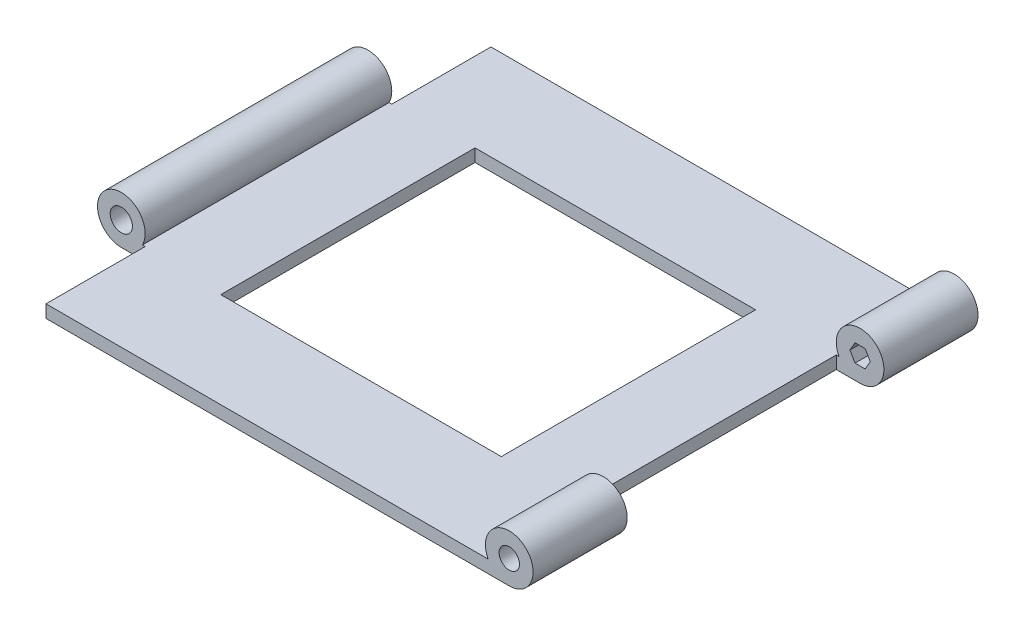
ISO-10303-21;
HEADER;
FILE_DESCRIPTION(('STEP AP214'),'2;1');
FILE_NAME('part.step','',(''),(''),'','','');
FILE_SCHEMA(('AUTOMOTIVE_DESIGN { 1 0 10303 214 1 1 1 1 }'));
ENDSEC;
DATA;
#1=APPLICATION_CONTEXT('core data for automotive mechanical design processes');
#2=APPLICATION_PROTOCOL_DEFINITION('international standard','automotive_design',2000,#1);
#3=PRODUCT_CONTEXT('',#1,'mechanical');
#4=PRODUCT('Part','Part','',(#3));
#5=PRODUCT_RELATED_PRODUCT_CATEGORY('part','',(#4));
#6=PRODUCT_DEFINITION_FORMATION('','',#4);
#7=PRODUCT_DEFINITION_CONTEXT('part definition',#1,'design');
#8=PRODUCT_DEFINITION('design','',#6,#7);
#9=PRODUCT_DEFINITION_SHAPE('','',#8);
#10=(LENGTH_UNIT() NAMED_UNIT(*) SI_UNIT(.MILLI.,.METRE.));
#11=(NAMED_UNIT(*) PLANE_ANGLE_UNIT() SI_UNIT($,.RADIAN.));
#12=(NAMED_UNIT(*) SI_UNIT($,.STERADIAN.) SOLID_ANGLE_UNIT());
#13=UNCERTAINTY_MEASURE_WITH_UNIT(LENGTH_MEASURE(1.E-05),#10,'distance_accuracy_value','');
#14=(GEOMETRIC_REPRESENTATION_CONTEXT(3) GLOBAL_UNCERTAINTY_ASSIGNED_CONTEXT((#13)) GLOBAL_UNIT_ASSIGNED_CONTEXT((#10,
#11,#12)) REPRESENTATION_CONTEXT('',''));
#15=CARTESIAN_POINT('',(0.,0.,0.));
#16=DIRECTION('',(0.,0.,1.));
#17=DIRECTION('',(1.,0.,0.));
#18=AXIS2_PLACEMENT_3D('',#15,#16,#17);
#19=CARTESIAN_POINT('',(75.786771652315,2.11250507632989,-140.));
#20=DIRECTION('',(0.,0.,1.));
#21=DIRECTION('',(1.,0.,0.));
#22=AXIS2_PLACEMENT_3D('',#19,#20,#21);
#23=CYLINDRICAL_SURFACE('',#22,7.5);
#24=CARTESIAN_POINT('',(75.786771652315,2.11250507632989,-29.6));
#25=DIRECTION('',(0.,0.,1.));
#26=DIRECTION('',(0.,-1.,0.));
#27=AXIS2_PLACEMENT_3D('',#24,#25,#26);
#28=CIRCLE('',#27,7.5);
#29=CARTESIAN_POINT('',(69.1535220716042,-1.38749492367011,-29.6));
#30=VERTEX_POINT('',#29);
#31=CARTESIAN_POINT('',(75.786771652315,-5.38749492367011,-29.6));
#32=VERTEX_POINT('',#31);
#33=EDGE_CURVE('E223',#30,#32,#28,.F.);
#34=ORIENTED_EDGE('',*,*,#33,.F.);
#35=DIRECTION('',(0.,0.,1.));
#36=VECTOR('',#35,1.);
#37=CARTESIAN_POINT('',(69.1535220716042,-1.38749492367011,-140.));
#38=LINE('',#37,#36);
#39=CARTESIAN_POINT('',(69.1535220716042,-1.38749492367011,0.));
#40=VERTEX_POINT('',#39);
#41=EDGE_CURVE('E334',#30,#40,#38,.T.);
#42=ORIENTED_EDGE('',*,*,#41,.T.);
#43=CARTESIAN_POINT('',(75.786771652315,2.11250507632989,0.));
#44=DIRECTION('',(0.,0.,1.));
#45=DIRECTION('',(1.,0.,0.));
#46=AXIS2_PLACEMENT_3D('',#43,#44,#45);
#47=CIRCLE('',#46,7.5);
#48=CARTESIAN_POINT('',(75.786771652315,-5.38749492367011,0.));
#49=VERTEX_POINT('',#48);
#50=EDGE_CURVE('E310',#49,#40,#47,.T.);
#51=ORIENTED_EDGE('',*,*,#50,.F.);
#52=DIRECTION('',(0.,0.,1.));
#53=VECTOR('',#52,1.);
#54=CARTESIAN_POINT('',(75.786771652315,-5.38749492367011,-140.));
#55=LINE('',#54,#53);
#56=EDGE_CURVE('E346',#32,#49,#55,.T.);
#57=ORIENTED_EDGE('',*,*,#56,.F.);
#58=EDGE_LOOP('',(#34,#42,#51,#57));
#59=FACE_BOUND('',#58,.T.);
#60=ADVANCED_FACE('F35',(#59),#23,.T.);
#61=CARTESIAN_POINT('',(78.986771652315,2.11250507632989,-140.));
#62=DIRECTION('',(0.866025403784437,0.500000000000002,0.));
#63=DIRECTION('',(-0.500000000000002,0.866025403784437,0.));
#64=AXIS2_PLACEMENT_3D('',#61,#62,#63);
#65=PLANE('',#64);
#66=DIRECTION('',(0.,0.,1.));
#67=VECTOR('',#66,1.);
#68=CARTESIAN_POINT('',(78.986771652315,2.11250507632989,-140.));
#69=LINE('',#68,#67);
#70=CARTESIAN_POINT('',(78.986771652315,2.11250507632989,-140.));
#71=VERTEX_POINT('',#70);
#72=CARTESIAN_POINT('',(78.986771652315,2.11250507632989,-110.4));
#73=VERTEX_POINT('',#72);
#74=EDGE_CURVE('E307',#71,#73,#69,.T.);
#75=ORIENTED_EDGE('',*,*,#74,.T.);
#76=DIRECTION('',(-0.500000000000002,0.866025403784437,0.));
#77=VECTOR('',#76,1.);
#78=CARTESIAN_POINT('',(78.986771652315,2.11250507632989,-110.4));
#79=LINE('',#78,#77);
#80=CARTESIAN_POINT('',(77.386771652315,4.88378636844011,-110.4));
#81=VERTEX_POINT('',#80);
#82=EDGE_CURVE('E239',#73,#81,#79,.T.);
#83=ORIENTED_EDGE('',*,*,#82,.T.);
#84=DIRECTION('',(0.,0.,1.));
#85=VECTOR('',#84,1.);
#86=CARTESIAN_POINT('',(77.386771652315,4.88378636844011,-140.));
#87=LINE('',#86,#85);
#88=CARTESIAN_POINT('',(77.386771652315,4.88378636844011,-140.));
#89=VERTEX_POINT('',#88);
#90=EDGE_CURVE('E306',#89,#81,#87,.T.);
#91=ORIENTED_EDGE('',*,*,#90,.F.);
#92=DIRECTION('',(-0.500000000000002,0.866025403784437,0.));
#93=VECTOR('',#92,1.);
#94=CARTESIAN_POINT('',(78.986771652315,2.11250507632989,-140.));
#95=LINE('',#94,#93);
#96=EDGE_CURVE('E288',#71,#89,#95,.T.);
#97=ORIENTED_EDGE('',*,*,#96,.F.);
#98=EDGE_LOOP('',(#75,#83,#91,#97));
#99=FACE_BOUND('',#98,.T.);
#100=ADVANCED_FACE('F391',(#99),#65,.F.);
#101=CARTESIAN_POINT('',(77.386771652315,-0.658776215780301,-140.));
#102=DIRECTION('',(0.866025403784439,-0.5,0.));
#103=DIRECTION('',(0.5,0.866025403784439,0.));
#104=AXIS2_PLACEMENT_3D('',#101,#102,#103);
#105=PLANE('',#104);
#106=DIRECTION('',(0.,0.,1.));
#107=VECTOR('',#106,1.);
#108=CARTESIAN_POINT('',(77.386771652315,-0.658776215780301,-140.));
#109=LINE('',#108,#107);
#110=CARTESIAN_POINT('',(77.386771652315,-0.658776215780301,-140.));
#111=VERTEX_POINT('',#110);
#112=CARTESIAN_POINT('',(77.386771652315,-0.658776215780301,-110.4));
#113=VERTEX_POINT('',#112);
#114=EDGE_CURVE('E311',#111,#113,#109,.T.);
#115=ORIENTED_EDGE('',*,*,#114,.T.);
#116=DIRECTION('',(0.5,0.866025403784439,0.));
#117=VECTOR('',#116,1.);
#118=CARTESIAN_POINT('',(77.386771652315,-0.658776215780301,-110.4));
#119=LINE('',#118,#117);
#120=EDGE_CURVE('E236',#113,#73,#119,.T.);
#121=ORIENTED_EDGE('',*,*,#120,.T.);
#122=ORIENTED_EDGE('',*,*,#74,.F.);
#123=DIRECTION('',(0.5,0.866025403784439,0.));
#124=VECTOR('',#123,1.);
#125=CARTESIAN_POINT('',(77.386771652315,-0.658776215780301,-140.));
#126=LINE('',#125,#124);
#127=EDGE_CURVE('E303',#111,#71,#126,.T.);
#128=ORIENTED_EDGE('',*,*,#127,.F.);
#129=EDGE_LOOP('',(#115,#121,#122,#128));
#130=FACE_BOUND('',#129,.T.);
#131=ADVANCED_FACE('F396',(#130),#105,.F.);
#132=CARTESIAN_POINT('',(74.186771652315,-0.658776215780301,-140.));
#133=DIRECTION('',(0.,-1.,0.));
#134=DIRECTION('',(0.,0.,-1.));
#135=AXIS2_PLACEMENT_3D('',#132,#133,#134);
#136=PLANE('',#135);
#137=DIRECTION('',(0.,0.,1.));
#138=VECTOR('',#137,1.);
#139=CARTESIAN_POINT('',(74.186771652315,-0.658776215780301,-140.));
#140=LINE('',#139,#138);
#141=CARTESIAN_POINT('',(74.186771652315,-0.658776215780301,-140.));
#142=VERTEX_POINT('',#141);
#143=CARTESIAN_POINT('',(74.186771652315,-0.658776215780301,-110.4));
#144=VERTEX_POINT('',#143);
#145=EDGE_CURVE('E314',#142,#144,#140,.T.);
#146=ORIENTED_EDGE('',*,*,#145,.T.);
#147=DIRECTION('',(1.,0.,0.));
#148=VECTOR('',#147,1.);
#149=CARTESIAN_POINT('',(74.186771652315,-0.658776215780301,-110.4));
#150=LINE('',#149,#148);
#151=EDGE_CURVE('E233',#144,#113,#150,.T.);
#152=ORIENTED_EDGE('',*,*,#151,.T.);
#153=ORIENTED_EDGE('',*,*,#114,.F.);
#154=DIRECTION('',(1.,0.,0.));
#155=VECTOR('',#154,1.);
#156=CARTESIAN_POINT('',(74.186771652315,-0.658776215780301,-140.));
#157=LINE('',#156,#155);
#158=EDGE_CURVE('E300',#142,#111,#157,.T.);
#159=ORIENTED_EDGE('',*,*,#158,.F.);
#160=EDGE_LOOP('',(#146,#152,#153,#159));
#161=FACE_BOUND('',#160,.T.);
#162=ADVANCED_FACE('F465',(#161),#136,.F.);
#163=CARTESIAN_POINT('',(72.586771652315,2.11250507632989,-140.));
#164=DIRECTION('',(-0.866025403784439,-0.5,0.));
#165=DIRECTION('',(0.5,-0.866025403784439,0.));
#166=AXIS2_PLACEMENT_3D('',#163,#164,#165);
#167=PLANE('',#166);
#168=DIRECTION('',(0.,0.,1.));
#169=VECTOR('',#168,1.);
#170=CARTESIAN_POINT('',(72.586771652315,2.11250507632989,-140.));
#171=LINE('',#170,#169);
#172=CARTESIAN_POINT('',(72.586771652315,2.11250507632989,-140.));
#173=VERTEX_POINT('',#172);
#174=CARTESIAN_POINT('',(72.586771652315,2.11250507632989,-110.4));
#175=VERTEX_POINT('',#174);
#176=EDGE_CURVE('E317',#173,#175,#171,.T.);
#177=ORIENTED_EDGE('',*,*,#176,.T.);
#178=DIRECTION('',(0.5,-0.866025403784439,0.));
#179=VECTOR('',#178,1.);
#180=CARTESIAN_POINT('',(72.586771652315,2.11250507632989,-110.4));
#181=LINE('',#180,#179);
#182=EDGE_CURVE('E230',#175,#144,#181,.T.);
#183=ORIENTED_EDGE('',*,*,#182,.T.);
#184=ORIENTED_EDGE('',*,*,#145,.F.);
#185=DIRECTION('',(0.5,-0.866025403784439,0.));
#186=VECTOR('',#185,1.);
#187=CARTESIAN_POINT('',(72.586771652315,2.11250507632989,-140.));
#188=LINE('',#187,#186);
#189=EDGE_CURVE('E297',#173,#142,#188,.T.);
#190=ORIENTED_EDGE('',*,*,#189,.F.);
#191=EDGE_LOOP('',(#177,#183,#184,#190));
#192=FACE_BOUND('',#191,.T.);
#193=ADVANCED_FACE('F472',(#192),#167,.F.);
#194=CARTESIAN_POINT('',(74.186771652315,4.88378636844011,-140.));
#195=DIRECTION('',(-0.866025403784439,0.499999999999999,0.));
#196=DIRECTION('',(-0.499999999999999,-0.866025403784439,0.));
#197=AXIS2_PLACEMENT_3D('',#194,#195,#196);
#198=PLANE('',#197);
#199=DIRECTION('',(0.,0.,1.));
#200=VECTOR('',#199,1.);
#201=CARTESIAN_POINT('',(74.186771652315,4.88378636844011,-140.));
#202=LINE('',#201,#200);
#203=CARTESIAN_POINT('',(74.186771652315,4.88378636844011,-140.));
#204=VERTEX_POINT('',#203);
#205=CARTESIAN_POINT('',(74.186771652315,4.88378636844011,-110.4));
#206=VERTEX_POINT('',#205);
#207=EDGE_CURVE('E320',#204,#206,#202,.T.);
#208=ORIENTED_EDGE('',*,*,#207,.T.);
#209=DIRECTION('',(-0.499999999999999,-0.866025403784439,0.));
#210=VECTOR('',#209,1.);
#211=CARTESIAN_POINT('',(74.186771652315,4.88378636844011,-110.4));
#212=LINE('',#211,#210);
#213=EDGE_CURVE('E227',#206,#175,#212,.T.);
#214=ORIENTED_EDGE('',*,*,#213,.T.);
#215=ORIENTED_EDGE('',*,*,#176,.F.);
#216=DIRECTION('',(-0.499999999999999,-0.866025403784439,0.));
#217=VECTOR('',#216,1.);
#218=CARTESIAN_POINT('',(74.186771652315,4.88378636844011,-140.));
#219=LINE('',#218,#217);
#220=EDGE_CURVE('E294',#204,#173,#219,.T.);
#221=ORIENTED_EDGE('',*,*,#220,.F.);
#222=EDGE_LOOP('',(#208,#214,#215,#221));
#223=FACE_BOUND('',#222,.T.);
#224=ADVANCED_FACE('F474',(#223),#198,.F.);
#225=CARTESIAN_POINT('',(77.386771652315,4.88378636844011,-140.));
#226=DIRECTION('',(0.,1.,0.));
#227=DIRECTION('',(0.,0.,1.));
#228=AXIS2_PLACEMENT_3D('',#225,#226,#227);
#229=PLANE('',#228);
#230=ORIENTED_EDGE('',*,*,#90,.T.);
#231=DIRECTION('',(-1.,0.,0.));
#232=VECTOR('',#231,1.);
#233=CARTESIAN_POINT('',(77.386771652315,4.88378636844011,-110.4));
#234=LINE('',#233,#232);
#235=EDGE_CURVE('E345',#81,#206,#234,.T.);
#236=ORIENTED_EDGE('',*,*,#235,.T.);
#237=ORIENTED_EDGE('',*,*,#207,.F.);
#238=DIRECTION('',(-1.,0.,0.));
#239=VECTOR('',#238,1.);
#240=CARTESIAN_POINT('',(77.386771652315,4.88378636844011,-140.));
#241=LINE('',#240,#239);
#242=EDGE_CURVE('E291',#89,#204,#241,.T.);
#243=ORIENTED_EDGE('',*,*,#242,.F.);
#244=EDGE_LOOP('',(#230,#236,#237,#243));
#245=FACE_BOUND('',#244,.T.);
#246=ADVANCED_FACE('F408',(#245),#229,.F.);
#247=CARTESIAN_POINT('',(75.786771652315,2.11250507632989,0.));
#248=DIRECTION('',(0.,0.,1.));
#249=DIRECTION('',(1.,0.,0.));
#250=AXIS2_PLACEMENT_3D('',#247,#248,#249);
#251=PLANE('',#250);
#252=CARTESIAN_POINT('',(75.786771652315,2.11250507632989,0.));
#253=DIRECTION('',(0.,0.,-1.));
#254=DIRECTION('',(-1.,0.,0.));
#255=AXIS2_PLACEMENT_3D('',#252,#253,#254);
#256=CIRCLE('',#255,3.20000000000002);
#257=CARTESIAN_POINT('',(72.586771652315,2.11250507632989,0.));
#258=VERTEX_POINT('',#257);
#259=EDGE_CURVE('E209',#258,#258,#256,.T.);
#260=ORIENTED_EDGE('',*,*,#259,.T.);
#261=EDGE_LOOP('',(#260));
#262=FACE_BOUND('',#261,.T.);
#263=DIRECTION('',(-1.,0.,0.));
#264=VECTOR('',#263,1.);
#265=CARTESIAN_POINT('',(69.1535220716042,-1.38749492367011,0.));
#266=LINE('',#265,#264);
#267=CARTESIAN_POINT('',(-69.9797275091066,-1.38749492367012,0.));
#268=VERTEX_POINT('',#267);
#269=EDGE_CURVE('E337',#40,#268,#266,.T.);
#270=ORIENTED_EDGE('',*,*,#269,.T.);
#271=DIRECTION('',(0.,-1.,0.));
#272=VECTOR('',#271,1.);
#273=CARTESIAN_POINT('',(-69.9797275091066,-7.86745165641634,0.));
#274=LINE('',#273,#272);
#275=CARTESIAN_POINT('',(-69.9797275091066,-5.38749492367015,0.));
#276=VERTEX_POINT('',#275);
#277=EDGE_CURVE('E252',#268,#276,#274,.T.);
#278=ORIENTED_EDGE('',*,*,#277,.T.);
#279=DIRECTION('',(1.,0.,0.));
#280=VECTOR('',#279,1.);
#281=CARTESIAN_POINT('',(-77.4797275091066,-5.38749492367015,0.));
#282=LINE('',#281,#280);
#283=EDGE_CURVE('E329',#276,#49,#282,.T.);
#284=ORIENTED_EDGE('',*,*,#283,.T.);
#285=ORIENTED_EDGE('',*,*,#50,.T.);
#286=EDGE_LOOP('',(#270,#278,#284,#285));
#287=FACE_BOUND('',#286,.T.);
#288=ADVANCED_FACE('F400',(#262,#287),#251,.T.);
#289=CARTESIAN_POINT('',(69.1535220716042,-1.38749492367011,-140.));
#290=VERTEX_POINT('',#289);
#291=CARTESIAN_POINT('',(69.1535220716042,-1.38749492367011,-110.4));
#292=VERTEX_POINT('',#291);
#293=EDGE_CURVE('E353',#290,#292,#38,.T.);
#294=ORIENTED_EDGE('',*,*,#293,.T.);
#295=CARTESIAN_POINT('',(75.786771652315,2.11250507632989,-110.4));
#296=DIRECTION('',(0.,0.,-1.));
#297=DIRECTION('',(-1.,0.,0.));
#298=AXIS2_PLACEMENT_3D('',#295,#296,#297);
#299=CIRCLE('',#298,7.5);
#300=CARTESIAN_POINT('',(75.786771652315,-5.38749492367011,-110.4));
#301=VERTEX_POINT('',#300);
#302=EDGE_CURVE('E245',#301,#292,#299,.F.);
#303=ORIENTED_EDGE('',*,*,#302,.F.);
#304=CARTESIAN_POINT('',(75.786771652315,-5.38749492367011,-140.));
#305=VERTEX_POINT('',#304);
#306=EDGE_CURVE('E342',#305,#301,#55,.T.);
#307=ORIENTED_EDGE('',*,*,#306,.F.);
#308=CARTESIAN_POINT('',(75.786771652315,2.11250507632989,-140.));
#309=DIRECTION('',(0.,0.,1.));
#310=DIRECTION('',(1.,0.,0.));
#311=AXIS2_PLACEMENT_3D('',#308,#309,#310);
#312=CIRCLE('',#311,7.5);
#313=EDGE_CURVE('E325',#305,#290,#312,.T.);
#314=ORIENTED_EDGE('',*,*,#313,.T.);
#315=EDGE_LOOP('',(#294,#303,#307,#314));
#316=FACE_BOUND('',#315,.T.);
#317=ADVANCED_FACE('F37',(#316),#23,.T.);
#318=CARTESIAN_POINT('',(-77.4797275091066,-5.38749492367015,-140.));
#319=DIRECTION('',(0.,-1.,0.));
#320=DIRECTION('',(1.,0.,0.));
#321=AXIS2_PLACEMENT_3D('',#318,#319,#320);
#322=PLANE('',#321);
#323=DIRECTION('',(0.,0.,-1.));
#324=VECTOR('',#323,1.);
#325=CARTESIAN_POINT('',(-44.9797275091066,-5.38749492367014,-30.));
#326=LINE('',#325,#324);
#327=CARTESIAN_POINT('',(-44.9797275091066,-5.38749492367014,-30.));
#328=VERTEX_POINT('',#327);
#329=CARTESIAN_POINT('',(-44.9797275091066,-5.38749492367014,-110.));
#330=VERTEX_POINT('',#329);
#331=EDGE_CURVE('E50',#328,#330,#326,.T.);
#332=ORIENTED_EDGE('',*,*,#331,.F.);
#333=DIRECTION('',(-1.,0.,0.));
#334=VECTOR('',#333,1.);
#335=CARTESIAN_POINT('',(-44.9797275091066,-5.38749492367014,-30.));
#336=LINE('',#335,#334);
#337=CARTESIAN_POINT('',(43.286771652315,-5.38749492367012,-30.));
#338=VERTEX_POINT('',#337);
#339=EDGE_CURVE('E202',#338,#328,#336,.T.);
#340=ORIENTED_EDGE('',*,*,#339,.F.);
#341=DIRECTION('',(0.,0.,1.));
#342=VECTOR('',#341,1.);
#343=CARTESIAN_POINT('',(43.286771652315,-5.38749492367012,-30.));
#344=LINE('',#343,#342);
#345=CARTESIAN_POINT('',(43.286771652315,-5.38749492367012,-110.));
#346=VERTEX_POINT('',#345);
#347=EDGE_CURVE('E186',#346,#338,#344,.T.);
#348=ORIENTED_EDGE('',*,*,#347,.F.);
#349=DIRECTION('',(1.,0.,0.));
#350=VECTOR('',#349,1.);
#351=CARTESIAN_POINT('',(-44.9797275091066,-5.38749492367014,-110.));
#352=LINE('',#351,#350);
#353=EDGE_CURVE('E195',#330,#346,#352,.T.);
#354=ORIENTED_EDGE('',*,*,#353,.F.);
#355=EDGE_LOOP('',(#332,#340,#348,#354));
#356=FACE_BOUND('',#355,.T.);
#357=DIRECTION('',(1.,0.,0.));
#358=VECTOR('',#357,1.);
#359=CARTESIAN_POINT('',(-77.4797275091066,-5.38749492367015,-110.4));
#360=LINE('',#359,#358);
#361=CARTESIAN_POINT('',(68.286771652315,-5.38749492367011,-110.4));
#362=VERTEX_POINT('',#361);
#363=EDGE_CURVE('E247',#362,#301,#360,.T.);
#364=ORIENTED_EDGE('',*,*,#363,.F.);
#365=DIRECTION('',(0.,0.,-1.));
#366=VECTOR('',#365,1.);
#367=CARTESIAN_POINT('',(68.286771652315,-5.38749492367011,-140.));
#368=LINE('',#367,#366);
#369=CARTESIAN_POINT('',(68.286771652315,-5.38749492367011,-29.6));
#370=VERTEX_POINT('',#369);
#371=EDGE_CURVE('E249',#370,#362,#368,.T.);
#372=ORIENTED_EDGE('',*,*,#371,.F.);
#373=DIRECTION('',(-1.,0.,0.));
#374=VECTOR('',#373,1.);
#375=CARTESIAN_POINT('',(-77.4797275091066,-5.38749492367015,-29.6));
#376=LINE('',#375,#374);
#377=EDGE_CURVE('E225',#32,#370,#376,.T.);
#378=ORIENTED_EDGE('',*,*,#377,.F.);
#379=ORIENTED_EDGE('',*,*,#56,.T.);
#380=ORIENTED_EDGE('',*,*,#283,.F.);
#381=DIRECTION('',(0.,0.,-1.));
#382=VECTOR('',#381,1.);
#383=CARTESIAN_POINT('',(-69.9797275091066,-5.38749492367015,-140.));
#384=LINE('',#383,#382);
#385=CARTESIAN_POINT('',(-69.9797275091066,-5.38749492367015,-31.2));
#386=VERTEX_POINT('',#385);
#387=EDGE_CURVE('E281',#276,#386,#384,.T.);
#388=ORIENTED_EDGE('',*,*,#387,.T.);
#389=DIRECTION('',(1.,0.,0.));
#390=VECTOR('',#389,1.);
#391=CARTESIAN_POINT('',(-77.4797275091066,-5.38749492367015,-31.2));
#392=LINE('',#391,#390);
#393=CARTESIAN_POINT('',(-77.4797275091066,-5.38749492367015,-31.2));
#394=VERTEX_POINT('',#393);
#395=EDGE_CURVE('E276',#394,#386,#392,.T.);
#396=ORIENTED_EDGE('',*,*,#395,.F.);
#397=DIRECTION('',(0.,0.,1.));
#398=VECTOR('',#397,1.);
#399=CARTESIAN_POINT('',(-77.4797275091066,-5.38749492367015,-140.));
#400=LINE('',#399,#398);
#401=CARTESIAN_POINT('',(-77.4797275091066,-5.38749492367015,-108.8));
#402=VERTEX_POINT('',#401);
#403=EDGE_CURVE('E347',#402,#394,#400,.T.);
#404=ORIENTED_EDGE('',*,*,#403,.F.);
#405=DIRECTION('',(-1.,0.,0.));
#406=VECTOR('',#405,1.);
#407=CARTESIAN_POINT('',(-77.4797275091066,-5.38749492367015,-108.8));
#408=LINE('',#407,#406);
#409=CARTESIAN_POINT('',(-69.9797275091066,-5.38749492367015,-108.8));
#410=VERTEX_POINT('',#409);
#411=EDGE_CURVE('E268',#410,#402,#408,.T.);
#412=ORIENTED_EDGE('',*,*,#411,.F.);
#413=DIRECTION('',(0.,0.,1.));
#414=VECTOR('',#413,1.);
#415=CARTESIAN_POINT('',(-69.9797275091066,-5.38749492367015,-140.));
#416=LINE('',#415,#414);
#417=CARTESIAN_POINT('',(-69.9797275091066,-5.38749492367015,-140.));
#418=VERTEX_POINT('',#417);
#419=EDGE_CURVE('E286',#418,#410,#416,.T.);
#420=ORIENTED_EDGE('',*,*,#419,.F.);
#421=DIRECTION('',(1.,0.,0.));
#422=VECTOR('',#421,1.);
#423=CARTESIAN_POINT('',(-77.4797275091066,-5.38749492367015,-140.));
#424=LINE('',#423,#422);
#425=EDGE_CURVE('E332',#418,#305,#424,.T.);
#426=ORIENTED_EDGE('',*,*,#425,.T.);
#427=ORIENTED_EDGE('',*,*,#306,.T.);
#428=EDGE_LOOP('',(#364,#372,#378,#379,#380,#388,#396,#404,#412,#420,#426,#427));
#429=FACE_BOUND('',#428,.T.);
#430=ADVANCED_FACE('F199',(#356,#429),#322,.T.);
#431=CARTESIAN_POINT('',(-77.4797275091066,2.11250507632985,-140.));
#432=DIRECTION('',(0.,0.,1.));
#433=DIRECTION('',(1.,0.,0.));
#434=AXIS2_PLACEMENT_3D('',#431,#432,#433);
#435=CYLINDRICAL_SURFACE('',#434,7.5);
#436=CARTESIAN_POINT('',(-77.4797275091066,2.11250507632985,-31.2));
#437=DIRECTION('',(0.,0.,-1.));
#438=DIRECTION('',(-1.,0.,0.));
#439=AXIS2_PLACEMENT_3D('',#436,#437,#438);
#440=CIRCLE('',#439,7.5);
#441=CARTESIAN_POINT('',(-70.8464779283958,-1.38749492367013,-31.2));
#442=VERTEX_POINT('',#441);
#443=EDGE_CURVE('E274',#442,#394,#440,.F.);
#444=ORIENTED_EDGE('',*,*,#443,.F.);
#445=DIRECTION('',(0.,0.,1.));
#446=VECTOR('',#445,1.);
#447=CARTESIAN_POINT('',(-70.8464779283958,-1.38749492367013,-140.));
#448=LINE('',#447,#446);
#449=CARTESIAN_POINT('',(-70.8464779283958,-1.38749492367013,-108.8));
#450=VERTEX_POINT('',#449);
#451=EDGE_CURVE('E350',#450,#442,#448,.T.);
#452=ORIENTED_EDGE('',*,*,#451,.F.);
#453=CARTESIAN_POINT('',(-77.4797275091066,2.11250507632985,-108.8));
#454=DIRECTION('',(0.,0.,1.));
#455=DIRECTION('',(1.,0.,0.));
#456=AXIS2_PLACEMENT_3D('',#453,#454,#455);
#457=CIRCLE('',#456,7.5);
#458=EDGE_CURVE('E266',#402,#450,#457,.F.);
#459=ORIENTED_EDGE('',*,*,#458,.F.);
#460=ORIENTED_EDGE('',*,*,#403,.T.);
#461=EDGE_LOOP('',(#444,#452,#459,#460));
#462=FACE_BOUND('',#461,.T.);
#463=ADVANCED_FACE('F406',(#462),#435,.T.);
#464=CARTESIAN_POINT('',(69.1535220716042,-1.38749492367011,-140.));
#465=DIRECTION('',(0.,1.,0.));
#466=DIRECTION('',(-1.,0.,0.));
#467=AXIS2_PLACEMENT_3D('',#464,#465,#466);
#468=PLANE('',#467);
#469=DIRECTION('',(0.,0.,1.));
#470=VECTOR('',#469,1.);
#471=CARTESIAN_POINT('',(-44.9797275091066,-1.38749492367012,-140.));
#472=LINE('',#471,#470);
#473=CARTESIAN_POINT('',(-44.9797275091066,-1.38749492367012,-110.));
#474=VERTEX_POINT('',#473);
#475=CARTESIAN_POINT('',(-44.9797275091066,-1.38749492367012,-30.));
#476=VERTEX_POINT('',#475);
#477=EDGE_CURVE('E11',#474,#476,#472,.T.);
#478=ORIENTED_EDGE('',*,*,#477,.F.);
#479=DIRECTION('',(-1.,0.,0.));
#480=VECTOR('',#479,1.);
#481=CARTESIAN_POINT('',(69.1535220716042,-1.38749492367011,-110.));
#482=LINE('',#481,#480);
#483=CARTESIAN_POINT('',(43.286771652315,-1.38749492367011,-110.));
#484=VERTEX_POINT('',#483);
#485=EDGE_CURVE('E367',#484,#474,#482,.T.);
#486=ORIENTED_EDGE('',*,*,#485,.F.);
#487=DIRECTION('',(0.,0.,-1.));
#488=VECTOR('',#487,1.);
#489=CARTESIAN_POINT('',(43.286771652315,-1.38749492367011,-140.));
#490=LINE('',#489,#488);
#491=CARTESIAN_POINT('',(43.286771652315,-1.38749492367011,-30.));
#492=VERTEX_POINT('',#491);
#493=EDGE_CURVE('E189',#492,#484,#490,.T.);
#494=ORIENTED_EDGE('',*,*,#493,.F.);
#495=DIRECTION('',(1.,0.,0.));
#496=VECTOR('',#495,1.);
#497=CARTESIAN_POINT('',(69.1535220716042,-1.38749492367011,-30.));
#498=LINE('',#497,#496);
#499=EDGE_CURVE('E43',#476,#492,#498,.T.);
#500=ORIENTED_EDGE('',*,*,#499,.F.);
#501=EDGE_LOOP('',(#478,#486,#494,#500));
#502=FACE_BOUND('',#501,.T.);
#503=DIRECTION('',(-1.,0.,0.));
#504=VECTOR('',#503,1.);
#505=CARTESIAN_POINT('',(69.1535220716042,-1.38749492367011,-110.4));
#506=LINE('',#505,#504);
#507=CARTESIAN_POINT('',(68.286771652315,-1.38749492367011,-110.4));
#508=VERTEX_POINT('',#507);
#509=EDGE_CURVE('E242',#292,#508,#506,.T.);
#510=ORIENTED_EDGE('',*,*,#509,.F.);
#511=ORIENTED_EDGE('',*,*,#293,.F.);
#512=DIRECTION('',(-1.,0.,0.));
#513=VECTOR('',#512,1.);
#514=CARTESIAN_POINT('',(69.1535220716042,-1.38749492367011,-140.));
#515=LINE('',#514,#513);
#516=CARTESIAN_POINT('',(-69.9797275091066,-1.38749492367013,-140.));
#517=VERTEX_POINT('',#516);
#518=EDGE_CURVE('E328',#290,#517,#515,.T.);
#519=ORIENTED_EDGE('',*,*,#518,.T.);
#520=DIRECTION('',(0.,0.,-1.));
#521=VECTOR('',#520,1.);
#522=CARTESIAN_POINT('',(-69.9797275091066,-1.38749492367013,-140.));
#523=LINE('',#522,#521);
#524=CARTESIAN_POINT('',(-69.9797275091066,-1.38749492367013,-108.8));
#525=VERTEX_POINT('',#524);
#526=EDGE_CURVE('E284',#525,#517,#523,.T.);
#527=ORIENTED_EDGE('',*,*,#526,.F.);
#528=DIRECTION('',(1.,0.,0.));
#529=VECTOR('',#528,1.);
#530=CARTESIAN_POINT('',(69.1535220716042,-1.38749492367011,-108.8));
#531=LINE('',#530,#529);
#532=EDGE_CURVE('E264',#450,#525,#531,.T.);
#533=ORIENTED_EDGE('',*,*,#532,.F.);
#534=ORIENTED_EDGE('',*,*,#451,.T.);
#535=DIRECTION('',(-1.,0.,0.));
#536=VECTOR('',#535,1.);
#537=CARTESIAN_POINT('',(69.1535220716042,-1.38749492367011,-31.2));
#538=LINE('',#537,#536);
#539=CARTESIAN_POINT('',(-69.9797275091066,-1.38749492367013,-31.2));
#540=VERTEX_POINT('',#539);
#541=EDGE_CURVE('E271',#540,#442,#538,.T.);
#542=ORIENTED_EDGE('',*,*,#541,.F.);
#543=DIRECTION('',(0.,0.,1.));
#544=VECTOR('',#543,1.);
#545=CARTESIAN_POINT('',(-69.9797275091066,-1.38749492367013,-140.));
#546=LINE('',#545,#544);
#547=EDGE_CURVE('E278',#540,#268,#546,.T.);
#548=ORIENTED_EDGE('',*,*,#547,.T.);
#549=ORIENTED_EDGE('',*,*,#269,.F.);
#550=ORIENTED_EDGE('',*,*,#41,.F.);
#551=DIRECTION('',(1.,0.,0.));
#552=VECTOR('',#551,1.);
#553=CARTESIAN_POINT('',(69.1535220716042,-1.38749492367011,-29.6));
#554=LINE('',#553,#552);
#555=CARTESIAN_POINT('',(68.286771652315,-1.38749492367011,-29.6));
#556=VERTEX_POINT('',#555);
#557=EDGE_CURVE('E220',#556,#30,#554,.T.);
#558=ORIENTED_EDGE('',*,*,#557,.F.);
#559=DIRECTION('',(0.,0.,1.));
#560=VECTOR('',#559,1.);
#561=CARTESIAN_POINT('',(68.286771652315,-1.38749492367011,-140.));
#562=LINE('',#561,#560);
#563=EDGE_CURVE('E362',#508,#556,#562,.T.);
#564=ORIENTED_EDGE('',*,*,#563,.F.);
#565=EDGE_LOOP('',(#510,#511,#519,#527,#533,#534,#542,#548,#549,#550,#558,#564));
#566=FACE_BOUND('',#565,.T.);
#567=ADVANCED_FACE('F375',(#502,#566),#468,.T.);
#568=CARTESIAN_POINT('',(75.786771652315,2.11250507632989,-140.));
#569=DIRECTION('',(0.,0.,1.));
#570=DIRECTION('',(1.,0.,0.));
#571=AXIS2_PLACEMENT_3D('',#568,#569,#570);
#572=PLANE('',#571);
#573=ORIENTED_EDGE('',*,*,#127,.T.);
#574=ORIENTED_EDGE('',*,*,#96,.T.);
#575=ORIENTED_EDGE('',*,*,#242,.T.);
#576=ORIENTED_EDGE('',*,*,#220,.T.);
#577=ORIENTED_EDGE('',*,*,#189,.T.);
#578=ORIENTED_EDGE('',*,*,#158,.T.);
#579=EDGE_LOOP('',(#573,#574,#575,#576,#577,#578));
#580=FACE_BOUND('',#579,.T.);
#581=ORIENTED_EDGE('',*,*,#425,.F.);
#582=DIRECTION('',(0.,1.,0.));
#583=VECTOR('',#582,1.);
#584=CARTESIAN_POINT('',(-69.9797275091066,-7.86745165641634,-140.));
#585=LINE('',#584,#583);
#586=EDGE_CURVE('E251',#418,#517,#585,.T.);
#587=ORIENTED_EDGE('',*,*,#586,.T.);
#588=ORIENTED_EDGE('',*,*,#518,.F.);
#589=ORIENTED_EDGE('',*,*,#313,.F.);
#590=EDGE_LOOP('',(#581,#587,#588,#589));
#591=FACE_BOUND('',#590,.T.);
#592=ADVANCED_FACE('F420',(#580,#591),#572,.F.);
#593=CARTESIAN_POINT('',(-119.979727509107,-7.86745165641634,-108.8));
#594=DIRECTION('',(0.,0.,1.));
#595=DIRECTION('',(1.,0.,0.));
#596=AXIS2_PLACEMENT_3D('',#593,#594,#595);
#597=PLANE('',#596);
#598=ORIENTED_EDGE('',*,*,#411,.T.);
#599=ORIENTED_EDGE('',*,*,#458,.T.);
#600=ORIENTED_EDGE('',*,*,#532,.T.);
#601=DIRECTION('',(0.,-1.,0.));
#602=VECTOR('',#601,1.);
#603=CARTESIAN_POINT('',(-69.9797275091066,-7.86745165641634,-108.8));
#604=LINE('',#603,#602);
#605=EDGE_CURVE('E256',#525,#410,#604,.T.);
#606=ORIENTED_EDGE('',*,*,#605,.T.);
#607=EDGE_LOOP('',(#598,#599,#600,#606));
#608=FACE_BOUND('',#607,.T.);
#609=CARTESIAN_POINT('',(-77.4797275091066,2.11250507632985,-108.8));
#610=DIRECTION('',(0.,0.,1.));
#611=DIRECTION('',(1.,0.,0.));
#612=AXIS2_PLACEMENT_3D('',#609,#610,#611);
#613=CIRCLE('',#612,3.50000000000001);
#614=CARTESIAN_POINT('',(-73.9797275091066,2.11250507632985,-108.8));
#615=VERTEX_POINT('',#614);
#616=EDGE_CURVE('E259',#615,#615,#613,.F.);
#617=ORIENTED_EDGE('',*,*,#616,.F.);
#618=EDGE_LOOP('',(#617));
#619=FACE_BOUND('',#618,.T.);
#620=ADVANCED_FACE('F431',(#608,#619),#597,.F.);
#621=CARTESIAN_POINT('',(-69.9797275091066,0.,0.));
#622=DIRECTION('',(1.,0.,0.));
#623=DIRECTION('',(0.,0.,-1.));
#624=AXIS2_PLACEMENT_3D('',#621,#622,#623);
#625=PLANE('',#624);
#626=ORIENTED_EDGE('',*,*,#419,.T.);
#627=ORIENTED_EDGE('',*,*,#605,.F.);
#628=ORIENTED_EDGE('',*,*,#526,.T.);
#629=ORIENTED_EDGE('',*,*,#586,.F.);
#630=EDGE_LOOP('',(#626,#627,#628,#629));
#631=FACE_BOUND('',#630,.T.);
#632=ADVANCED_FACE('F423',(#631),#625,.F.);
#633=CARTESIAN_POINT('',(-119.979727509107,-7.86745165641634,-31.2));
#634=DIRECTION('',(0.,0.,-1.));
#635=DIRECTION('',(-1.,0.,0.));
#636=AXIS2_PLACEMENT_3D('',#633,#634,#635);
#637=PLANE('',#636);
#638=ORIENTED_EDGE('',*,*,#395,.T.);
#639=DIRECTION('',(0.,1.,0.));
#640=VECTOR('',#639,1.);
#641=CARTESIAN_POINT('',(-69.9797275091066,-7.86745165641634,-31.2));
#642=LINE('',#641,#640);
#643=EDGE_CURVE('E255',#386,#540,#642,.T.);
#644=ORIENTED_EDGE('',*,*,#643,.T.);
#645=ORIENTED_EDGE('',*,*,#541,.T.);
#646=ORIENTED_EDGE('',*,*,#443,.T.);
#647=EDGE_LOOP('',(#638,#644,#645,#646));
#648=FACE_BOUND('',#647,.T.);
#649=CARTESIAN_POINT('',(-77.4797275091066,2.11250507632985,-31.2));
#650=DIRECTION('',(0.,0.,-1.));
#651=DIRECTION('',(-1.,0.,0.));
#652=AXIS2_PLACEMENT_3D('',#649,#650,#651);
#653=CIRCLE('',#652,3.50000000000001);
#654=CARTESIAN_POINT('',(-80.9797275091066,2.11250507632985,-31.2));
#655=VERTEX_POINT('',#654);
#656=EDGE_CURVE('E270',#655,#655,#653,.F.);
#657=ORIENTED_EDGE('',*,*,#656,.F.);
#658=EDGE_LOOP('',(#657));
#659=FACE_BOUND('',#658,.T.);
#660=ADVANCED_FACE('F439',(#648,#659),#637,.F.);
#661=CARTESIAN_POINT('',(-69.9797275091066,0.,0.));
#662=DIRECTION('',(-1.,0.,0.));
#663=DIRECTION('',(0.,0.,1.));
#664=AXIS2_PLACEMENT_3D('',#661,#662,#663);
#665=PLANE('',#664);
#666=ORIENTED_EDGE('',*,*,#277,.F.);
#667=ORIENTED_EDGE('',*,*,#547,.F.);
#668=ORIENTED_EDGE('',*,*,#643,.F.);
#669=ORIENTED_EDGE('',*,*,#387,.F.);
#670=EDGE_LOOP('',(#666,#667,#668,#669));
#671=FACE_BOUND('',#670,.T.);
#672=ADVANCED_FACE('F443',(#671),#665,.T.);
#673=CARTESIAN_POINT('',(-77.4797275091066,2.11250507632985,-140.));
#674=DIRECTION('',(0.,0.,1.));
#675=DIRECTION('',(1.,0.,0.));
#676=AXIS2_PLACEMENT_3D('',#673,#674,#675);
#677=CYLINDRICAL_SURFACE('',#676,3.50000000000001);
#678=ORIENTED_EDGE('',*,*,#656,.T.);
#679=EDGE_LOOP('',(#678));
#680=FACE_BOUND('',#679,.T.);
#681=ORIENTED_EDGE('',*,*,#616,.T.);
#682=EDGE_LOOP('',(#681));
#683=FACE_BOUND('',#682,.T.);
#684=ADVANCED_FACE('F461',(#680,#683),#677,.F.);
#685=CARTESIAN_POINT('',(128.286771652315,22.4020565112184,-110.4));
#686=DIRECTION('',(0.,0.,-1.));
#687=DIRECTION('',(-1.,0.,0.));
#688=AXIS2_PLACEMENT_3D('',#685,#686,#687);
#689=PLANE('',#688);
#690=ORIENTED_EDGE('',*,*,#363,.T.);
#691=ORIENTED_EDGE('',*,*,#302,.T.);
#692=ORIENTED_EDGE('',*,*,#509,.T.);
#693=DIRECTION('',(0.,-1.,0.));
#694=VECTOR('',#693,1.);
#695=CARTESIAN_POINT('',(68.286771652315,22.4020565112184,-110.4));
#696=LINE('',#695,#694);
#697=EDGE_CURVE('E214',#508,#362,#696,.T.);
#698=ORIENTED_EDGE('',*,*,#697,.T.);
#699=EDGE_LOOP('',(#690,#691,#692,#698));
#700=FACE_BOUND('',#699,.T.);
#701=ORIENTED_EDGE('',*,*,#120,.F.);
#702=ORIENTED_EDGE('',*,*,#151,.F.);
#703=ORIENTED_EDGE('',*,*,#182,.F.);
#704=ORIENTED_EDGE('',*,*,#213,.F.);
#705=ORIENTED_EDGE('',*,*,#235,.F.);
#706=ORIENTED_EDGE('',*,*,#82,.F.);
#707=EDGE_LOOP('',(#701,#702,#703,#704,#705,#706));
#708=FACE_BOUND('',#707,.T.);
#709=ADVANCED_FACE('F458',(#700,#708),#689,.F.);
#710=CARTESIAN_POINT('',(128.286771652315,22.4020565112184,-29.6));
#711=DIRECTION('',(0.,0.,1.));
#712=DIRECTION('',(0.,-1.,0.));
#713=AXIS2_PLACEMENT_3D('',#710,#711,#712);
#714=PLANE('',#713);
#715=ORIENTED_EDGE('',*,*,#377,.T.);
#716=DIRECTION('',(0.,1.,0.));
#717=VECTOR('',#716,1.);
#718=CARTESIAN_POINT('',(68.286771652315,22.4020565112184,-29.6));
#719=LINE('',#718,#717);
#720=EDGE_CURVE('E217',#370,#556,#719,.T.);
#721=ORIENTED_EDGE('',*,*,#720,.T.);
#722=ORIENTED_EDGE('',*,*,#557,.T.);
#723=ORIENTED_EDGE('',*,*,#33,.T.);
#724=EDGE_LOOP('',(#715,#721,#722,#723));
#725=FACE_BOUND('',#724,.T.);
#726=CARTESIAN_POINT('',(75.786771652315,2.11250507632989,-29.6));
#727=DIRECTION('',(0.,0.,1.));
#728=DIRECTION('',(0.,-1.,0.));
#729=AXIS2_PLACEMENT_3D('',#726,#727,#728);
#730=CIRCLE('',#729,3.20000000000002);
#731=CARTESIAN_POINT('',(75.786771652315,-1.08749492367013,-29.6));
#732=VERTEX_POINT('',#731);
#733=EDGE_CURVE('E364',#732,#732,#730,.T.);
#734=ORIENTED_EDGE('',*,*,#733,.T.);
#735=EDGE_LOOP('',(#734));
#736=FACE_BOUND('',#735,.T.);
#737=ADVANCED_FACE('F452',(#725,#736),#714,.F.);
#738=CARTESIAN_POINT('',(68.286771652315,0.,0.));
#739=DIRECTION('',(-1.,0.,0.));
#740=DIRECTION('',(0.,0.,1.));
#741=AXIS2_PLACEMENT_3D('',#738,#739,#740);
#742=PLANE('',#741);
#743=ORIENTED_EDGE('',*,*,#371,.T.);
#744=ORIENTED_EDGE('',*,*,#697,.F.);
#745=ORIENTED_EDGE('',*,*,#563,.T.);
#746=ORIENTED_EDGE('',*,*,#720,.F.);
#747=EDGE_LOOP('',(#743,#744,#745,#746));
#748=FACE_BOUND('',#747,.T.);
#749=ADVANCED_FACE('F386',(#748),#742,.F.);
#750=CARTESIAN_POINT('',(75.786771652315,2.11250507632989,0.));
#751=DIRECTION('',(0.,0.,-1.));
#752=DIRECTION('',(-1.,0.,0.));
#753=AXIS2_PLACEMENT_3D('',#750,#751,#752);
#754=CYLINDRICAL_SURFACE('',#753,3.20000000000002);
#755=ORIENTED_EDGE('',*,*,#259,.F.);
#756=EDGE_LOOP('',(#755));
#757=FACE_BOUND('',#756,.T.);
#758=ORIENTED_EDGE('',*,*,#733,.F.);
#759=EDGE_LOOP('',(#758));
#760=FACE_BOUND('',#759,.T.);
#761=ADVANCED_FACE('F379',(#757,#760),#754,.F.);
#762=CARTESIAN_POINT('',(-44.9797275091066,9.6125050763299,-30.));
#763=DIRECTION('',(-1.,0.,0.));
#764=DIRECTION('',(0.,-1.,0.));
#765=AXIS2_PLACEMENT_3D('',#762,#763,#764);
#766=PLANE('',#765);
#767=ORIENTED_EDGE('',*,*,#477,.T.);
#768=DIRECTION('',(0.,-1.,0.));
#769=VECTOR('',#768,1.);
#770=CARTESIAN_POINT('',(-44.9797275091066,9.6125050763299,-30.));
#771=LINE('',#770,#769);
#772=EDGE_CURVE('E207',#476,#328,#771,.T.);
#773=ORIENTED_EDGE('',*,*,#772,.T.);
#774=ORIENTED_EDGE('',*,*,#331,.T.);
#775=DIRECTION('',(0.,-1.,0.));
#776=VECTOR('',#775,1.);
#777=CARTESIAN_POINT('',(-44.9797275091066,9.6125050763299,-110.));
#778=LINE('',#777,#776);
#779=EDGE_CURVE('E192',#474,#330,#778,.T.);
#780=ORIENTED_EDGE('',*,*,#779,.F.);
#781=EDGE_LOOP('',(#767,#773,#774,#780));
#782=FACE_BOUND('',#781,.T.);
#783=ADVANCED_FACE('F377',(#782),#766,.F.);
#784=CARTESIAN_POINT('',(-44.9797275091066,9.6125050763299,-30.));
#785=DIRECTION('',(0.,0.,1.));
#786=DIRECTION('',(1.,0.,0.));
#787=AXIS2_PLACEMENT_3D('',#784,#785,#786);
#788=PLANE('',#787);
#789=ORIENTED_EDGE('',*,*,#499,.T.);
#790=DIRECTION('',(0.,-1.,0.));
#791=VECTOR('',#790,1.);
#792=CARTESIAN_POINT('',(43.286771652315,9.61250507632992,-30.));
#793=LINE('',#792,#791);
#794=EDGE_CURVE('E191',#492,#338,#793,.T.);
#795=ORIENTED_EDGE('',*,*,#794,.T.);
#796=ORIENTED_EDGE('',*,*,#339,.T.);
#797=ORIENTED_EDGE('',*,*,#772,.F.);
#798=EDGE_LOOP('',(#789,#795,#796,#797));
#799=FACE_BOUND('',#798,.T.);
#800=ADVANCED_FACE('F372',(#799),#788,.F.);
#801=CARTESIAN_POINT('',(43.286771652315,9.61250507632992,-30.));
#802=DIRECTION('',(1.,0.,0.));
#803=DIRECTION('',(0.,1.,0.));
#804=AXIS2_PLACEMENT_3D('',#801,#802,#803);
#805=PLANE('',#804);
#806=ORIENTED_EDGE('',*,*,#493,.T.);
#807=DIRECTION('',(0.,-1.,0.));
#808=VECTOR('',#807,1.);
#809=CARTESIAN_POINT('',(43.286771652315,9.61250507632992,-110.));
#810=LINE('',#809,#808);
#811=EDGE_CURVE('E58',#484,#346,#810,.T.);
#812=ORIENTED_EDGE('',*,*,#811,.T.);
#813=ORIENTED_EDGE('',*,*,#347,.T.);
#814=ORIENTED_EDGE('',*,*,#794,.F.);
#815=EDGE_LOOP('',(#806,#812,#813,#814));
#816=FACE_BOUND('',#815,.T.);
#817=ADVANCED_FACE('F183',(#816),#805,.F.);
#818=CARTESIAN_POINT('',(-44.9797275091066,9.6125050763299,-110.));
#819=DIRECTION('',(0.,0.,-1.));
#820=DIRECTION('',(-1.,0.,0.));
#821=AXIS2_PLACEMENT_3D('',#818,#819,#820);
#822=PLANE('',#821);
#823=ORIENTED_EDGE('',*,*,#485,.T.);
#824=ORIENTED_EDGE('',*,*,#779,.T.);
#825=ORIENTED_EDGE('',*,*,#353,.T.);
#826=ORIENTED_EDGE('',*,*,#811,.F.);
#827=EDGE_LOOP('',(#823,#824,#825,#826));
#828=FACE_BOUND('',#827,.T.);
#829=ADVANCED_FACE('F196',(#828),#822,.F.);
#830=CLOSED_SHELL('',(#60,#100,#131,#162,#193,#224,#246,#288,#317,#430,#463,#567,#592,#620,#632,
#660,#672,#684,#709,#737,#749,#761,#783,#800,#817,#829));
#831=MANIFOLD_SOLID_BREP('B2',#830);
#832=ADVANCED_BREP_SHAPE_REPRESENTATION('',(#18,#831),#14);
#833=SHAPE_DEFINITION_REPRESENTATION(#9,#832);
ENDSEC;
END-ISO-10303-21;
